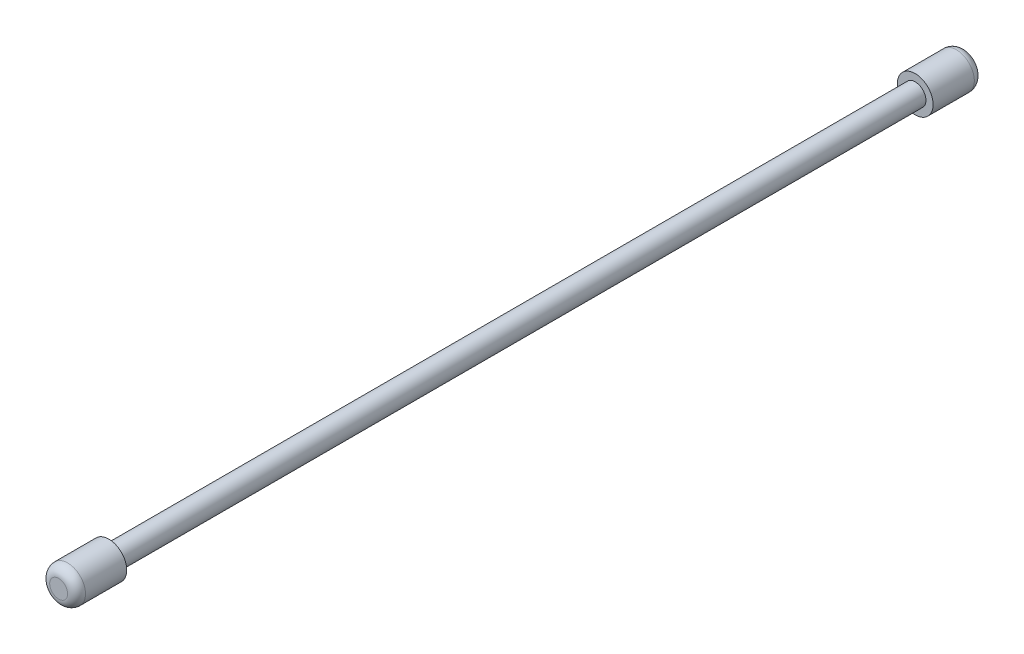
ISO-10303-21;
HEADER;
FILE_DESCRIPTION(('STEP AP214'),'2;1');
FILE_NAME('part.step','',(''),(''),'','','');
FILE_SCHEMA(('AUTOMOTIVE_DESIGN { 1 0 10303 214 1 1 1 1 }'));
ENDSEC;
DATA;
#1=APPLICATION_CONTEXT('core data for automotive mechanical design processes');
#2=APPLICATION_PROTOCOL_DEFINITION('international standard','automotive_design',2000,#1);
#3=PRODUCT_CONTEXT('',#1,'mechanical');
#4=PRODUCT('Part','Part','',(#3));
#5=PRODUCT_RELATED_PRODUCT_CATEGORY('part','',(#4));
#6=PRODUCT_DEFINITION_FORMATION('','',#4);
#7=PRODUCT_DEFINITION_CONTEXT('part definition',#1,'design');
#8=PRODUCT_DEFINITION('design','',#6,#7);
#9=PRODUCT_DEFINITION_SHAPE('','',#8);
#10=(LENGTH_UNIT() NAMED_UNIT(*) SI_UNIT(.MILLI.,.METRE.));
#11=(NAMED_UNIT(*) PLANE_ANGLE_UNIT() SI_UNIT($,.RADIAN.));
#12=(NAMED_UNIT(*) SI_UNIT($,.STERADIAN.) SOLID_ANGLE_UNIT());
#13=UNCERTAINTY_MEASURE_WITH_UNIT(LENGTH_MEASURE(1.E-05),#10,'distance_accuracy_value','');
#14=(GEOMETRIC_REPRESENTATION_CONTEXT(3) GLOBAL_UNCERTAINTY_ASSIGNED_CONTEXT((#13)) GLOBAL_UNIT_ASSIGNED_CONTEXT((#10,
#11,#12)) REPRESENTATION_CONTEXT('',''));
#15=CARTESIAN_POINT('',(0.,0.,0.));
#16=DIRECTION('',(0.,0.,1.));
#17=DIRECTION('',(1.,0.,0.));
#18=AXIS2_PLACEMENT_3D('',#15,#16,#17);
#19=CARTESIAN_POINT('',(0.,0.,-248.));
#20=DIRECTION('',(0.,0.,-1.));
#21=DIRECTION('',(-1.,0.,0.));
#22=AXIS2_PLACEMENT_3D('',#19,#20,#21);
#23=DEGENERATE_TOROIDAL_SURFACE('',#22,5.,5.,.T.);
#24=CARTESIAN_POINT('',(0.,0.,-248.));
#25=DIRECTION('',(0.,0.,-1.));
#26=DIRECTION('',(-1.,0.,0.));
#27=AXIS2_PLACEMENT_3D('',#24,#25,#26);
#28=CIRCLE('',#27,10.);
#29=CARTESIAN_POINT('',(-10.,0.,-248.));
#30=VERTEX_POINT('',#29);
#31=EDGE_CURVE('E41',#30,#30,#28,.F.);
#32=ORIENTED_EDGE('',*,*,#31,.F.);
#33=EDGE_LOOP('',(#32));
#34=FACE_BOUND('',#33,.T.);
#35=CARTESIAN_POINT('',(0.,0.,-253.));
#36=DIRECTION('',(0.,0.,-1.));
#37=DIRECTION('',(-1.,0.,0.));
#38=AXIS2_PLACEMENT_3D('',#35,#36,#37);
#39=CIRCLE('',#38,5.);
#40=CARTESIAN_POINT('',(-5.,0.,-253.));
#41=VERTEX_POINT('',#40);
#42=EDGE_CURVE('E10',#41,#41,#39,.T.);
#43=ORIENTED_EDGE('',*,*,#42,.F.);
#44=EDGE_LOOP('',(#43));
#45=FACE_BOUND('',#44,.T.);
#46=ADVANCED_FACE('F34',(#34,#45),#23,.T.);
#47=CARTESIAN_POINT('',(0.,0.,-250.));
#48=DIRECTION('',(0.,0.,1.));
#49=DIRECTION('',(1.,0.,0.));
#50=AXIS2_PLACEMENT_3D('',#47,#48,#49);
#51=CYLINDRICAL_SURFACE('',#50,6.);
#52=CARTESIAN_POINT('',(0.,0.,225.));
#53=DIRECTION('',(0.,0.,1.));
#54=DIRECTION('',(1.,0.,0.));
#55=AXIS2_PLACEMENT_3D('',#52,#53,#54);
#56=CIRCLE('',#55,6.);
#57=CARTESIAN_POINT('',(6.,0.,225.));
#58=VERTEX_POINT('',#57);
#59=EDGE_CURVE('E60',#58,#58,#56,.F.);
#60=ORIENTED_EDGE('',*,*,#59,.T.);
#61=EDGE_LOOP('',(#60));
#62=FACE_BOUND('',#61,.T.);
#63=CARTESIAN_POINT('',(0.,0.,-225.));
#64=DIRECTION('',(0.,0.,-1.));
#65=DIRECTION('',(-1.,0.,0.));
#66=AXIS2_PLACEMENT_3D('',#63,#64,#65);
#67=CIRCLE('',#66,6.);
#68=CARTESIAN_POINT('',(-6.,0.,-225.));
#69=VERTEX_POINT('',#68);
#70=EDGE_CURVE('E66',#69,#69,#67,.F.);
#71=ORIENTED_EDGE('',*,*,#70,.T.);
#72=EDGE_LOOP('',(#71));
#73=FACE_BOUND('',#72,.T.);
#74=ADVANCED_FACE('F91',(#62,#73),#51,.T.);
#75=CARTESIAN_POINT('',(0.,0.,248.));
#76=DIRECTION('',(0.,0.,1.));
#77=DIRECTION('',(1.,0.,0.));
#78=AXIS2_PLACEMENT_3D('',#75,#76,#77);
#79=DEGENERATE_TOROIDAL_SURFACE('',#78,5.,5.,.T.);
#80=CARTESIAN_POINT('',(0.,0.,248.));
#81=DIRECTION('',(0.,0.,1.));
#82=DIRECTION('',(1.,0.,0.));
#83=AXIS2_PLACEMENT_3D('',#80,#81,#82);
#84=CIRCLE('',#83,10.);
#85=CARTESIAN_POINT('',(10.,0.,248.));
#86=VERTEX_POINT('',#85);
#87=EDGE_CURVE('E54',#86,#86,#84,.F.);
#88=ORIENTED_EDGE('',*,*,#87,.F.);
#89=EDGE_LOOP('',(#88));
#90=FACE_BOUND('',#89,.T.);
#91=CARTESIAN_POINT('',(0.,0.,253.));
#92=DIRECTION('',(0.,0.,1.));
#93=DIRECTION('',(1.,0.,0.));
#94=AXIS2_PLACEMENT_3D('',#91,#92,#93);
#95=CIRCLE('',#94,5.);
#96=CARTESIAN_POINT('',(5.,0.,253.));
#97=VERTEX_POINT('',#96);
#98=EDGE_CURVE('E49',#97,#97,#95,.T.);
#99=ORIENTED_EDGE('',*,*,#98,.F.);
#100=EDGE_LOOP('',(#99));
#101=FACE_BOUND('',#100,.T.);
#102=ADVANCED_FACE('F96',(#90,#101),#79,.T.);
#103=CARTESIAN_POINT('',(0.,0.,225.));
#104=DIRECTION('',(0.,0.,1.));
#105=DIRECTION('',(1.,0.,0.));
#106=AXIS2_PLACEMENT_3D('',#103,#104,#105);
#107=CYLINDRICAL_SURFACE('',#106,10.);
#108=ORIENTED_EDGE('',*,*,#87,.T.);
#109=EDGE_LOOP('',(#108));
#110=FACE_BOUND('',#109,.T.);
#111=CARTESIAN_POINT('',(0.,0.,225.));
#112=DIRECTION('',(0.,0.,1.));
#113=DIRECTION('',(1.,0.,0.));
#114=AXIS2_PLACEMENT_3D('',#111,#112,#113);
#115=CIRCLE('',#114,10.);
#116=CARTESIAN_POINT('',(10.,0.,225.));
#117=VERTEX_POINT('',#116);
#118=EDGE_CURVE('E63',#117,#117,#115,.T.);
#119=ORIENTED_EDGE('',*,*,#118,.T.);
#120=EDGE_LOOP('',(#119));
#121=FACE_BOUND('',#120,.T.);
#122=ADVANCED_FACE('F103',(#110,#121),#107,.T.);
#123=CARTESIAN_POINT('',(0.,0.,225.));
#124=DIRECTION('',(0.,0.,1.));
#125=DIRECTION('',(1.,0.,0.));
#126=AXIS2_PLACEMENT_3D('',#123,#124,#125);
#127=PLANE('',#126);
#128=ORIENTED_EDGE('',*,*,#59,.F.);
#129=EDGE_LOOP('',(#128));
#130=FACE_BOUND('',#129,.T.);
#131=ORIENTED_EDGE('',*,*,#118,.F.);
#132=EDGE_LOOP('',(#131));
#133=FACE_BOUND('',#132,.T.);
#134=ADVANCED_FACE('F87',(#130,#133),#127,.F.);
#135=CARTESIAN_POINT('',(0.,0.,253.));
#136=DIRECTION('',(0.,0.,1.));
#137=DIRECTION('',(1.,0.,0.));
#138=AXIS2_PLACEMENT_3D('',#135,#136,#137);
#139=PLANE('',#138);
#140=ORIENTED_EDGE('',*,*,#98,.T.);
#141=EDGE_LOOP('',(#140));
#142=FACE_BOUND('',#141,.T.);
#143=ADVANCED_FACE('F77',(#142),#139,.T.);
#144=CARTESIAN_POINT('',(0.,0.,-225.));
#145=DIRECTION('',(0.,0.,-1.));
#146=DIRECTION('',(-1.,0.,0.));
#147=AXIS2_PLACEMENT_3D('',#144,#145,#146);
#148=CYLINDRICAL_SURFACE('',#147,10.);
#149=ORIENTED_EDGE('',*,*,#31,.T.);
#150=EDGE_LOOP('',(#149));
#151=FACE_BOUND('',#150,.T.);
#152=CARTESIAN_POINT('',(0.,0.,-225.));
#153=DIRECTION('',(0.,0.,1.));
#154=DIRECTION('',(1.,0.,0.));
#155=AXIS2_PLACEMENT_3D('',#152,#153,#154);
#156=CIRCLE('',#155,10.);
#157=CARTESIAN_POINT('',(10.,0.,-225.));
#158=VERTEX_POINT('',#157);
#159=EDGE_CURVE('E69',#158,#158,#156,.T.);
#160=ORIENTED_EDGE('',*,*,#159,.F.);
#161=EDGE_LOOP('',(#160));
#162=FACE_BOUND('',#161,.T.);
#163=ADVANCED_FACE('F75',(#151,#162),#148,.T.);
#164=CARTESIAN_POINT('',(0.,0.,-225.));
#165=DIRECTION('',(0.,0.,-1.));
#166=DIRECTION('',(1.,0.,0.));
#167=AXIS2_PLACEMENT_3D('',#164,#165,#166);
#168=PLANE('',#167);
#169=ORIENTED_EDGE('',*,*,#70,.F.);
#170=EDGE_LOOP('',(#169));
#171=FACE_BOUND('',#170,.T.);
#172=ORIENTED_EDGE('',*,*,#159,.T.);
#173=EDGE_LOOP('',(#172));
#174=FACE_BOUND('',#173,.T.);
#175=ADVANCED_FACE('F73',(#171,#174),#168,.F.);
#176=CARTESIAN_POINT('',(0.,0.,-253.));
#177=DIRECTION('',(0.,0.,-1.));
#178=DIRECTION('',(1.,0.,0.));
#179=AXIS2_PLACEMENT_3D('',#176,#177,#178);
#180=PLANE('',#179);
#181=ORIENTED_EDGE('',*,*,#42,.T.);
#182=EDGE_LOOP('',(#181));
#183=FACE_BOUND('',#182,.T.);
#184=ADVANCED_FACE('F83',(#183),#180,.T.);
#185=CLOSED_SHELL('',(#46,#74,#102,#122,#134,#143,#163,#175,#184));
#186=CARTESIAN_POINT('',(0.,0.,-225.));
#187=DIRECTION('',(0.,0.,-1.));
#188=DIRECTION('',(-1.,0.,0.));
#189=AXIS2_PLACEMENT_3D('',#186,#187,#188);
#190=CIRCLE('',#189,5.);
#191=CARTESIAN_POINT('',(-5.,0.,-225.));
#192=VERTEX_POINT('',#191);
#193=EDGE_CURVE('E45',#192,#192,#190,.F.);
#194=ORIENTED_EDGE('',*,*,#193,.T.);
#195=EDGE_LOOP('',(#194));
#196=FACE_BOUND('',#195,.T.);
#197=ADVANCED_FACE('F86',(#196),#168,.F.);
#198=CARTESIAN_POINT('',(0.,0.,225.));
#199=DIRECTION('',(0.,0.,1.));
#200=DIRECTION('',(1.,0.,0.));
#201=AXIS2_PLACEMENT_3D('',#198,#199,#200);
#202=CIRCLE('',#201,5.);
#203=CARTESIAN_POINT('',(5.,0.,225.));
#204=VERTEX_POINT('',#203);
#205=EDGE_CURVE('E57',#204,#204,#202,.F.);
#206=ORIENTED_EDGE('',*,*,#205,.T.);
#207=EDGE_LOOP('',(#206));
#208=FACE_BOUND('',#207,.T.);
#209=ADVANCED_FACE('F110',(#208),#127,.F.);
#210=CARTESIAN_POINT('',(0.,0.,-250.));
#211=DIRECTION('',(0.,0.,1.));
#212=DIRECTION('',(1.,0.,0.));
#213=AXIS2_PLACEMENT_3D('',#210,#211,#212);
#214=CYLINDRICAL_SURFACE('',#213,5.);
#215=ORIENTED_EDGE('',*,*,#205,.F.);
#216=EDGE_LOOP('',(#215));
#217=FACE_BOUND('',#216,.T.);
#218=ORIENTED_EDGE('',*,*,#193,.F.);
#219=EDGE_LOOP('',(#218));
#220=FACE_BOUND('',#219,.T.);
#221=ADVANCED_FACE('F107',(#217,#220),#214,.F.);
#222=CLOSED_SHELL('',(#197,#209,#221));
#223=ORIENTED_CLOSED_SHELL('',*,#222,.T.);
#224=BREP_WITH_VOIDS('B2',#185,(#223));
#225=ADVANCED_BREP_SHAPE_REPRESENTATION('',(#18,#224),#14);
#226=SHAPE_DEFINITION_REPRESENTATION(#9,#225);
ENDSEC;
END-ISO-10303-21;
